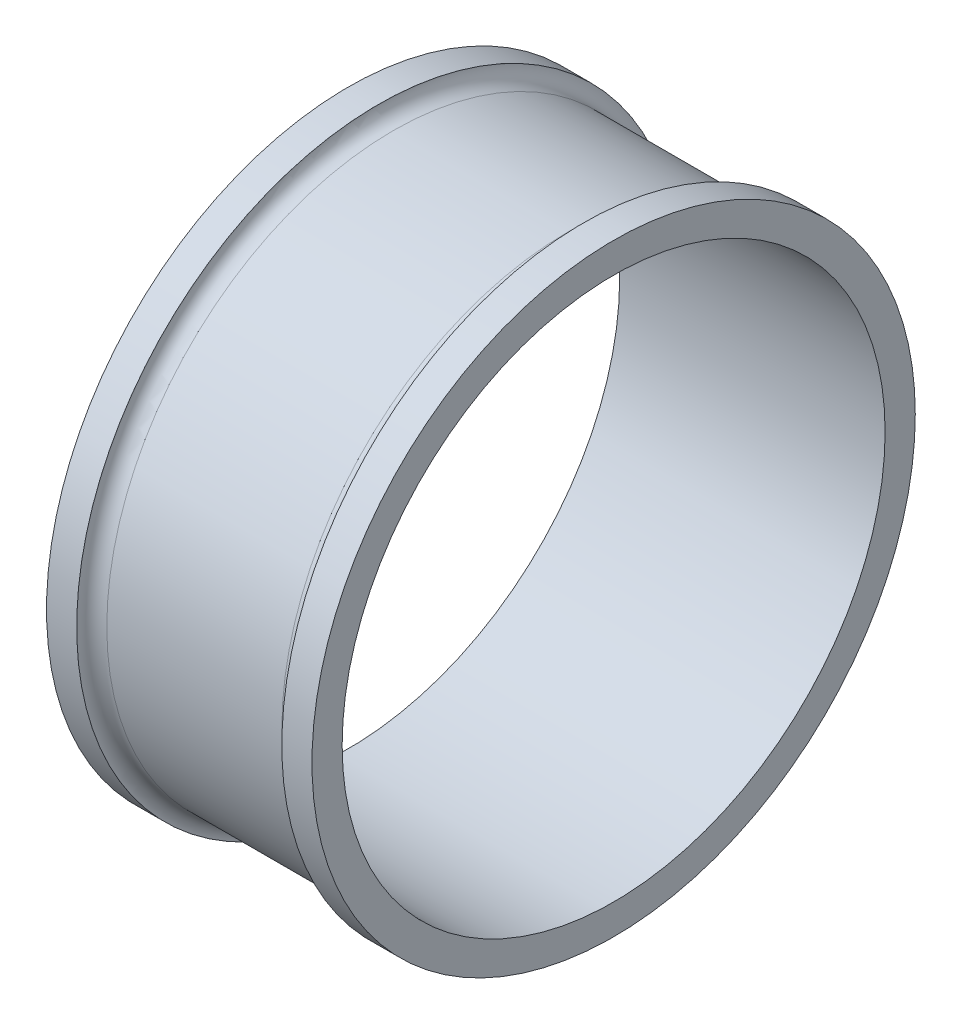
ISO-10303-21;
HEADER;
FILE_DESCRIPTION(('STEP AP214'),'2;1');
FILE_NAME('part.step','',(''),(''),'','','');
FILE_SCHEMA(('AUTOMOTIVE_DESIGN { 1 0 10303 214 1 1 1 1 }'));
ENDSEC;
DATA;
#1=APPLICATION_CONTEXT('core data for automotive mechanical design processes');
#2=APPLICATION_PROTOCOL_DEFINITION('international standard','automotive_design',2000,#1);
#3=PRODUCT_CONTEXT('',#1,'mechanical');
#4=PRODUCT('Part','Part','',(#3));
#5=PRODUCT_RELATED_PRODUCT_CATEGORY('part','',(#4));
#6=PRODUCT_DEFINITION_FORMATION('','',#4);
#7=PRODUCT_DEFINITION_CONTEXT('part definition',#1,'design');
#8=PRODUCT_DEFINITION('design','',#6,#7);
#9=PRODUCT_DEFINITION_SHAPE('','',#8);
#10=(LENGTH_UNIT() NAMED_UNIT(*) SI_UNIT(.MILLI.,.METRE.));
#11=(NAMED_UNIT(*) PLANE_ANGLE_UNIT() SI_UNIT($,.RADIAN.));
#12=(NAMED_UNIT(*) SI_UNIT($,.STERADIAN.) SOLID_ANGLE_UNIT());
#13=UNCERTAINTY_MEASURE_WITH_UNIT(LENGTH_MEASURE(1.E-05),#10,'distance_accuracy_value','');
#14=(GEOMETRIC_REPRESENTATION_CONTEXT(3) GLOBAL_UNCERTAINTY_ASSIGNED_CONTEXT((#13)) GLOBAL_UNIT_ASSIGNED_CONTEXT((#10,
#11,#12)) REPRESENTATION_CONTEXT('',''));
#15=CARTESIAN_POINT('',(0.,0.,0.));
#16=DIRECTION('',(0.,0.,1.));
#17=DIRECTION('',(1.,0.,0.));
#18=AXIS2_PLACEMENT_3D('',#15,#16,#17);
#19=CARTESIAN_POINT('',(62.9787234042553,0.,0.));
#20=DIRECTION('',(1.,0.,0.));
#21=DIRECTION('',(0.,0.,-1.));
#22=AXIS2_PLACEMENT_3D('',#19,#20,#21);
#23=CYLINDRICAL_SURFACE('',#22,50.);
#24=CARTESIAN_POINT('',(17.,0.,0.));
#25=DIRECTION('',(1.,0.,0.));
#26=DIRECTION('',(0.,0.,-1.));
#27=AXIS2_PLACEMENT_3D('',#24,#25,#26);
#28=CIRCLE('',#27,50.);
#29=CARTESIAN_POINT('',(17.,0.,-50.));
#30=VERTEX_POINT('',#29);
#31=EDGE_CURVE('E66',#30,#30,#28,.T.);
#32=ORIENTED_EDGE('',*,*,#31,.T.);
#33=EDGE_LOOP('',(#32));
#34=FACE_BOUND('',#33,.T.);
#35=CARTESIAN_POINT('',(22.,0.,0.));
#36=DIRECTION('',(1.,0.,0.));
#37=DIRECTION('',(0.,0.,-1.));
#38=AXIS2_PLACEMENT_3D('',#35,#36,#37);
#39=CIRCLE('',#38,50.);
#40=CARTESIAN_POINT('',(22.,0.,-50.));
#41=VERTEX_POINT('',#40);
#42=EDGE_CURVE('E10',#41,#41,#39,.T.);
#43=ORIENTED_EDGE('',*,*,#42,.F.);
#44=EDGE_LOOP('',(#43));
#45=FACE_BOUND('',#44,.T.);
#46=ADVANCED_FACE('F32',(#34,#45),#23,.T.);
#47=CARTESIAN_POINT('',(22.,45.,0.));
#48=DIRECTION('',(1.,0.,0.));
#49=DIRECTION('',(0.,0.,-1.));
#50=AXIS2_PLACEMENT_3D('',#47,#48,#49);
#51=PLANE('',#50);
#52=ORIENTED_EDGE('',*,*,#42,.T.);
#53=EDGE_LOOP('',(#52));
#54=FACE_BOUND('',#53,.T.);
#55=CARTESIAN_POINT('',(22.,0.,0.));
#56=DIRECTION('',(1.,0.,0.));
#57=DIRECTION('',(0.,0.,-1.));
#58=AXIS2_PLACEMENT_3D('',#55,#56,#57);
#59=CIRCLE('',#58,45.);
#60=CARTESIAN_POINT('',(22.,0.,-45.));
#61=VERTEX_POINT('',#60);
#62=EDGE_CURVE('E38',#61,#61,#59,.T.);
#63=ORIENTED_EDGE('',*,*,#62,.F.);
#64=EDGE_LOOP('',(#63));
#65=FACE_BOUND('',#64,.T.);
#66=ADVANCED_FACE('F84',(#54,#65),#51,.T.);
#67=CARTESIAN_POINT('',(62.9787234042553,0.,0.));
#68=DIRECTION('',(1.,0.,0.));
#69=DIRECTION('',(0.,0.,-1.));
#70=AXIS2_PLACEMENT_3D('',#67,#68,#69);
#71=CYLINDRICAL_SURFACE('',#70,45.);
#72=ORIENTED_EDGE('',*,*,#62,.T.);
#73=EDGE_LOOP('',(#72));
#74=FACE_BOUND('',#73,.T.);
#75=CARTESIAN_POINT('',(-22.,0.,0.));
#76=DIRECTION('',(1.,0.,0.));
#77=DIRECTION('',(0.,0.,-1.));
#78=AXIS2_PLACEMENT_3D('',#75,#76,#77);
#79=CIRCLE('',#78,45.);
#80=CARTESIAN_POINT('',(-22.,0.,-45.));
#81=VERTEX_POINT('',#80);
#82=EDGE_CURVE('E42',#81,#81,#79,.T.);
#83=ORIENTED_EDGE('',*,*,#82,.F.);
#84=EDGE_LOOP('',(#83));
#85=FACE_BOUND('',#84,.T.);
#86=ADVANCED_FACE('F88',(#74,#85),#71,.F.);
#87=CARTESIAN_POINT('',(-22.,45.,0.));
#88=DIRECTION('',(-1.,0.,0.));
#89=DIRECTION('',(0.,0.,1.));
#90=AXIS2_PLACEMENT_3D('',#87,#88,#89);
#91=PLANE('',#90);
#92=ORIENTED_EDGE('',*,*,#82,.T.);
#93=EDGE_LOOP('',(#92));
#94=FACE_BOUND('',#93,.T.);
#95=CARTESIAN_POINT('',(-22.,0.,0.));
#96=DIRECTION('',(1.,0.,0.));
#97=DIRECTION('',(0.,0.,-1.));
#98=AXIS2_PLACEMENT_3D('',#95,#96,#97);
#99=CIRCLE('',#98,50.);
#100=CARTESIAN_POINT('',(-22.,0.,-50.));
#101=VERTEX_POINT('',#100);
#102=EDGE_CURVE('E46',#101,#101,#99,.T.);
#103=ORIENTED_EDGE('',*,*,#102,.F.);
#104=EDGE_LOOP('',(#103));
#105=FACE_BOUND('',#104,.T.);
#106=ADVANCED_FACE('F92',(#94,#105),#91,.T.);
#107=CARTESIAN_POINT('',(62.9787234042553,0.,0.));
#108=DIRECTION('',(1.,0.,0.));
#109=DIRECTION('',(0.,0.,-1.));
#110=AXIS2_PLACEMENT_3D('',#107,#108,#109);
#111=CYLINDRICAL_SURFACE('',#110,50.);
#112=ORIENTED_EDGE('',*,*,#102,.T.);
#113=EDGE_LOOP('',(#112));
#114=FACE_BOUND('',#113,.T.);
#115=CARTESIAN_POINT('',(-17.,0.,0.));
#116=DIRECTION('',(1.,0.,0.));
#117=DIRECTION('',(0.,0.,-1.));
#118=AXIS2_PLACEMENT_3D('',#115,#116,#117);
#119=CIRCLE('',#118,50.);
#120=CARTESIAN_POINT('',(-17.,0.,-50.));
#121=VERTEX_POINT('',#120);
#122=EDGE_CURVE('E51',#121,#121,#119,.T.);
#123=ORIENTED_EDGE('',*,*,#122,.F.);
#124=EDGE_LOOP('',(#123));
#125=FACE_BOUND('',#124,.T.);
#126=ADVANCED_FACE('F98',(#114,#125),#111,.T.);
#127=CARTESIAN_POINT('',(-17.,50.,0.));
#128=DIRECTION('',(1.,0.,0.));
#129=DIRECTION('',(0.,0.,-1.));
#130=AXIS2_PLACEMENT_3D('',#127,#128,#129);
#131=PLANE('',#130);
#132=ORIENTED_EDGE('',*,*,#122,.T.);
#133=EDGE_LOOP('',(#132));
#134=FACE_BOUND('',#133,.T.);
#135=CARTESIAN_POINT('',(-17.,0.,0.));
#136=DIRECTION('',(1.,0.,0.));
#137=DIRECTION('',(0.,0.,-1.));
#138=AXIS2_PLACEMENT_3D('',#135,#136,#137);
#139=CIRCLE('',#138,49.99);
#140=CARTESIAN_POINT('',(-17.,0.,-49.99));
#141=VERTEX_POINT('',#140);
#142=EDGE_CURVE('E54',#141,#141,#139,.T.);
#143=ORIENTED_EDGE('',*,*,#142,.F.);
#144=EDGE_LOOP('',(#143));
#145=FACE_BOUND('',#144,.T.);
#146=ADVANCED_FACE('F102',(#134,#145),#131,.T.);
#147=CARTESIAN_POINT('',(-14.51,0.,0.));
#148=DIRECTION('',(1.,0.,0.));
#149=DIRECTION('',(0.,0.,-1.));
#150=AXIS2_PLACEMENT_3D('',#147,#148,#149);
#151=TOROIDAL_SURFACE('',#150,49.99,2.49);
#152=ORIENTED_EDGE('',*,*,#142,.T.);
#153=EDGE_LOOP('',(#152));
#154=FACE_BOUND('',#153,.T.);
#155=CARTESIAN_POINT('',(-14.51,0.,0.));
#156=DIRECTION('',(1.,0.,0.));
#157=DIRECTION('',(0.,0.,-1.));
#158=AXIS2_PLACEMENT_3D('',#155,#156,#157);
#159=CIRCLE('',#158,47.5);
#160=CARTESIAN_POINT('',(-14.51,0.,-47.5));
#161=VERTEX_POINT('',#160);
#162=EDGE_CURVE('E57',#161,#161,#159,.T.);
#163=ORIENTED_EDGE('',*,*,#162,.F.);
#164=EDGE_LOOP('',(#163));
#165=FACE_BOUND('',#164,.T.);
#166=ADVANCED_FACE('F106',(#154,#165),#151,.F.);
#167=CARTESIAN_POINT('',(62.9787234042553,0.,0.));
#168=DIRECTION('',(1.,0.,0.));
#169=DIRECTION('',(0.,0.,-1.));
#170=AXIS2_PLACEMENT_3D('',#167,#168,#169);
#171=CYLINDRICAL_SURFACE('',#170,47.5);
#172=ORIENTED_EDGE('',*,*,#162,.T.);
#173=EDGE_LOOP('',(#172));
#174=FACE_BOUND('',#173,.T.);
#175=CARTESIAN_POINT('',(14.51,0.,0.));
#176=DIRECTION('',(1.,0.,0.));
#177=DIRECTION('',(0.,0.,-1.));
#178=AXIS2_PLACEMENT_3D('',#175,#176,#177);
#179=CIRCLE('',#178,47.5);
#180=CARTESIAN_POINT('',(14.51,0.,-47.5));
#181=VERTEX_POINT('',#180);
#182=EDGE_CURVE('E60',#181,#181,#179,.T.);
#183=ORIENTED_EDGE('',*,*,#182,.F.);
#184=EDGE_LOOP('',(#183));
#185=FACE_BOUND('',#184,.T.);
#186=ADVANCED_FACE('F80',(#174,#185),#171,.T.);
#187=CARTESIAN_POINT('',(14.51,0.,0.));
#188=DIRECTION('',(1.,0.,0.));
#189=DIRECTION('',(0.,0.,-1.));
#190=AXIS2_PLACEMENT_3D('',#187,#188,#189);
#191=TOROIDAL_SURFACE('',#190,49.99,2.49);
#192=ORIENTED_EDGE('',*,*,#182,.T.);
#193=EDGE_LOOP('',(#192));
#194=FACE_BOUND('',#193,.T.);
#195=CARTESIAN_POINT('',(17.,0.,0.));
#196=DIRECTION('',(1.,0.,0.));
#197=DIRECTION('',(0.,0.,-1.));
#198=AXIS2_PLACEMENT_3D('',#195,#196,#197);
#199=CIRCLE('',#198,49.99);
#200=CARTESIAN_POINT('',(17.,0.,-49.99));
#201=VERTEX_POINT('',#200);
#202=EDGE_CURVE('E63',#201,#201,#199,.T.);
#203=ORIENTED_EDGE('',*,*,#202,.F.);
#204=EDGE_LOOP('',(#203));
#205=FACE_BOUND('',#204,.T.);
#206=ADVANCED_FACE('F74',(#194,#205),#191,.F.);
#207=CARTESIAN_POINT('',(17.,50.,0.));
#208=DIRECTION('',(-1.,0.,0.));
#209=DIRECTION('',(0.,0.,1.));
#210=AXIS2_PLACEMENT_3D('',#207,#208,#209);
#211=PLANE('',#210);
#212=ORIENTED_EDGE('',*,*,#202,.T.);
#213=EDGE_LOOP('',(#212));
#214=FACE_BOUND('',#213,.T.);
#215=ORIENTED_EDGE('',*,*,#31,.F.);
#216=EDGE_LOOP('',(#215));
#217=FACE_BOUND('',#216,.T.);
#218=ADVANCED_FACE('F72',(#214,#217),#211,.T.);
#219=CLOSED_SHELL('',(#46,#66,#86,#106,#126,#146,#166,#186,#206,#218));
#220=MANIFOLD_SOLID_BREP('B2',#219);
#221=ADVANCED_BREP_SHAPE_REPRESENTATION('',(#18,#220),#14);
#222=SHAPE_DEFINITION_REPRESENTATION(#9,#221);
ENDSEC;
END-ISO-10303-21;
